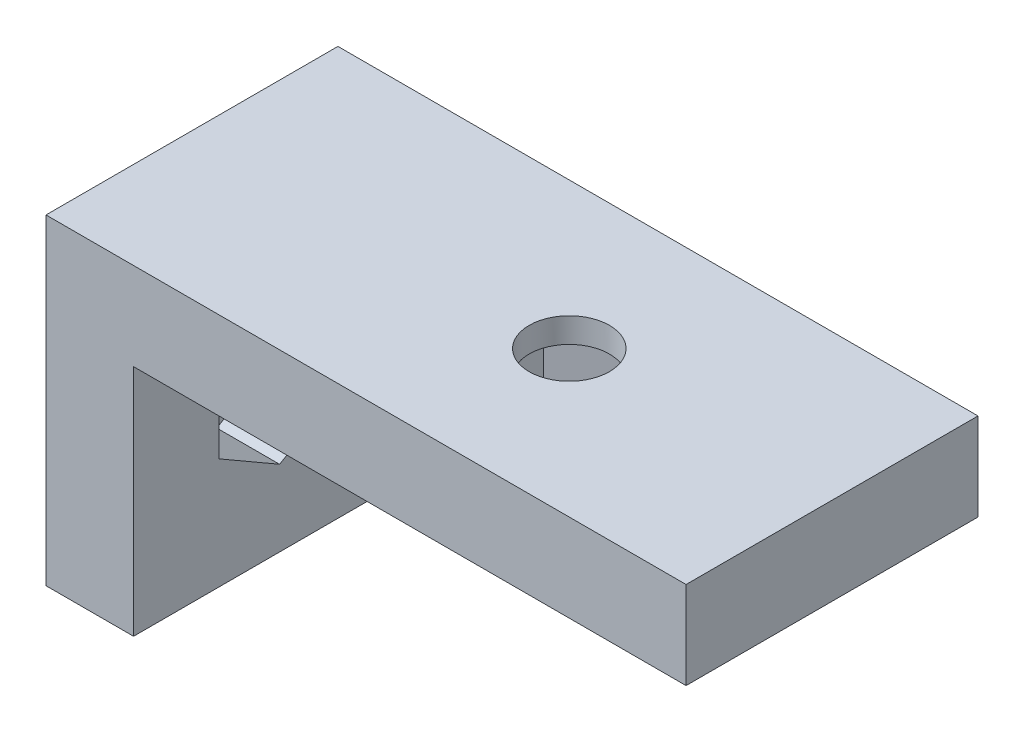
ISO-10303-21;
HEADER;
FILE_DESCRIPTION(('STEP AP214'),'2;1');
FILE_NAME('part.step','',(''),(''),'','','');
FILE_SCHEMA(('AUTOMOTIVE_DESIGN { 1 0 10303 214 1 1 1 1 }'));
ENDSEC;
DATA;
#1=APPLICATION_CONTEXT('core data for automotive mechanical design processes');
#2=APPLICATION_PROTOCOL_DEFINITION('international standard','automotive_design',2000,#1);
#3=PRODUCT_CONTEXT('',#1,'mechanical');
#4=PRODUCT('Part','Part','',(#3));
#5=PRODUCT_RELATED_PRODUCT_CATEGORY('part','',(#4));
#6=PRODUCT_DEFINITION_FORMATION('','',#4);
#7=PRODUCT_DEFINITION_CONTEXT('part definition',#1,'design');
#8=PRODUCT_DEFINITION('design','',#6,#7);
#9=PRODUCT_DEFINITION_SHAPE('','',#8);
#10=(LENGTH_UNIT() NAMED_UNIT(*) SI_UNIT(.MILLI.,.METRE.));
#11=(NAMED_UNIT(*) PLANE_ANGLE_UNIT() SI_UNIT($,.RADIAN.));
#12=(NAMED_UNIT(*) SI_UNIT($,.STERADIAN.) SOLID_ANGLE_UNIT());
#13=UNCERTAINTY_MEASURE_WITH_UNIT(LENGTH_MEASURE(1.E-05),#10,'distance_accuracy_value','');
#14=(GEOMETRIC_REPRESENTATION_CONTEXT(3) GLOBAL_UNCERTAINTY_ASSIGNED_CONTEXT((#13)) GLOBAL_UNIT_ASSIGNED_CONTEXT((#10,
#11,#12)) REPRESENTATION_CONTEXT('',''));
#15=CARTESIAN_POINT('',(0.,0.,0.));
#16=DIRECTION('',(0.,0.,1.));
#17=DIRECTION('',(1.,0.,0.));
#18=AXIS2_PLACEMENT_3D('',#15,#16,#17);
#19=CARTESIAN_POINT('',(6.15,-12.,10.));
#20=DIRECTION('',(-1.,0.,0.));
#21=DIRECTION('',(0.,0.,1.));
#22=AXIS2_PLACEMENT_3D('',#19,#20,#21);
#23=CYLINDRICAL_SURFACE('',#22,2.75);
#24=CARTESIAN_POINT('',(6.15,-12.,10.));
#25=DIRECTION('',(1.,0.,0.));
#26=DIRECTION('',(0.,0.,-1.));
#27=AXIS2_PLACEMENT_3D('',#24,#25,#26);
#28=CIRCLE('',#27,2.75);
#29=CARTESIAN_POINT('',(6.15,-12.,7.25));
#30=VERTEX_POINT('',#29);
#31=EDGE_CURVE('E222',#30,#30,#28,.F.);
#32=ORIENTED_EDGE('',*,*,#31,.T.);
#33=EDGE_LOOP('',(#32));
#34=FACE_BOUND('',#33,.T.);
#35=CARTESIAN_POINT('',(7.85,-12.,10.));
#36=DIRECTION('',(1.,0.,0.));
#37=DIRECTION('',(0.,0.,-1.));
#38=AXIS2_PLACEMENT_3D('',#35,#36,#37);
#39=CIRCLE('',#38,2.75);
#40=CARTESIAN_POINT('',(7.85,-12.,7.25));
#41=VERTEX_POINT('',#40);
#42=EDGE_CURVE('E45',#41,#41,#39,.T.);
#43=ORIENTED_EDGE('',*,*,#42,.T.);
#44=EDGE_LOOP('',(#43));
#45=FACE_BOUND('',#44,.T.);
#46=ADVANCED_FACE('F41',(#34,#45),#23,.F.);
#47=CARTESIAN_POINT('',(6.15,0.,20.));
#48=DIRECTION('',(1.,0.,0.));
#49=DIRECTION('',(0.,0.,-1.));
#50=AXIS2_PLACEMENT_3D('',#47,#48,#49);
#51=PLANE('',#50);
#52=ORIENTED_EDGE('',*,*,#31,.F.);
#53=EDGE_LOOP('',(#52));
#54=FACE_BOUND('',#53,.T.);
#55=DIRECTION('',(0.,-1.,0.));
#56=VECTOR('',#55,1.);
#57=CARTESIAN_POINT('',(6.15,0.,0.));
#58=LINE('',#57,#56);
#59=CARTESIAN_POINT('',(6.15,0.,0.));
#60=VERTEX_POINT('',#59);
#61=CARTESIAN_POINT('',(6.15,-22.,0.));
#62=VERTEX_POINT('',#61);
#63=EDGE_CURVE('E287',#60,#62,#58,.T.);
#64=ORIENTED_EDGE('',*,*,#63,.T.);
#65=DIRECTION('',(0.,0.,-1.));
#66=VECTOR('',#65,1.);
#67=CARTESIAN_POINT('',(6.15,-22.,20.));
#68=LINE('',#67,#66);
#69=CARTESIAN_POINT('',(6.15,-22.,20.));
#70=VERTEX_POINT('',#69);
#71=EDGE_CURVE('E11',#70,#62,#68,.T.);
#72=ORIENTED_EDGE('',*,*,#71,.F.);
#73=DIRECTION('',(0.,-1.,0.));
#74=VECTOR('',#73,1.);
#75=CARTESIAN_POINT('',(6.15,0.,20.));
#76=LINE('',#75,#74);
#77=CARTESIAN_POINT('',(6.15,0.,20.));
#78=VERTEX_POINT('',#77);
#79=EDGE_CURVE('E272',#78,#70,#76,.T.);
#80=ORIENTED_EDGE('',*,*,#79,.F.);
#81=DIRECTION('',(0.,0.,-1.));
#82=VECTOR('',#81,1.);
#83=CARTESIAN_POINT('',(6.15,0.,20.));
#84=LINE('',#83,#82);
#85=EDGE_CURVE('E286',#78,#60,#84,.T.);
#86=ORIENTED_EDGE('',*,*,#85,.T.);
#87=EDGE_LOOP('',(#64,#72,#80,#86));
#88=FACE_BOUND('',#87,.T.);
#89=ADVANCED_FACE('F43',(#54,#88),#51,.F.);
#90=CARTESIAN_POINT('',(6.15,-22.,20.));
#91=DIRECTION('',(0.,1.,0.));
#92=DIRECTION('',(0.,0.,1.));
#93=AXIS2_PLACEMENT_3D('',#90,#91,#92);
#94=PLANE('',#93);
#95=DIRECTION('',(1.,0.,0.));
#96=VECTOR('',#95,1.);
#97=CARTESIAN_POINT('',(6.15,-22.,0.));
#98=LINE('',#97,#96);
#99=CARTESIAN_POINT('',(12.15,-22.,0.));
#100=VERTEX_POINT('',#99);
#101=EDGE_CURVE('E290',#62,#100,#98,.T.);
#102=ORIENTED_EDGE('',*,*,#101,.T.);
#103=DIRECTION('',(0.,0.,-1.));
#104=VECTOR('',#103,1.);
#105=CARTESIAN_POINT('',(12.15,-22.,20.));
#106=LINE('',#105,#104);
#107=CARTESIAN_POINT('',(12.15,-22.,20.));
#108=VERTEX_POINT('',#107);
#109=EDGE_CURVE('E50',#108,#100,#106,.T.);
#110=ORIENTED_EDGE('',*,*,#109,.F.);
#111=DIRECTION('',(1.,0.,0.));
#112=VECTOR('',#111,1.);
#113=CARTESIAN_POINT('',(6.15,-22.,20.));
#114=LINE('',#113,#112);
#115=EDGE_CURVE('E275',#70,#108,#114,.T.);
#116=ORIENTED_EDGE('',*,*,#115,.F.);
#117=ORIENTED_EDGE('',*,*,#71,.T.);
#118=EDGE_LOOP('',(#102,#110,#116,#117));
#119=FACE_BOUND('',#118,.T.);
#120=ADVANCED_FACE('F341',(#119),#94,.F.);
#121=CARTESIAN_POINT('',(12.15,-22.,20.));
#122=DIRECTION('',(-1.,0.,0.));
#123=DIRECTION('',(0.,0.,1.));
#124=AXIS2_PLACEMENT_3D('',#121,#122,#123);
#125=PLANE('',#124);
#126=DIRECTION('',(0.,-0.5,0.866025403784439));
#127=VECTOR('',#126,1.);
#128=CARTESIAN_POINT('',(12.15,-7.20799276572611,10.));
#129=LINE('',#128,#127);
#130=CARTESIAN_POINT('',(12.15,-7.2079927657261,10.));
#131=VERTEX_POINT('',#130);
#132=CARTESIAN_POINT('',(12.15,-9.60399638286305,14.15));
#133=VERTEX_POINT('',#132);
#134=EDGE_CURVE('E203',#131,#133,#129,.T.);
#135=ORIENTED_EDGE('',*,*,#134,.F.);
#136=DIRECTION('',(0.,0.5,0.866025403784439));
#137=VECTOR('',#136,1.);
#138=CARTESIAN_POINT('',(12.15,-9.60399638286305,5.85));
#139=LINE('',#138,#137);
#140=CARTESIAN_POINT('',(12.15,-9.60399638286305,5.85));
#141=VERTEX_POINT('',#140);
#142=EDGE_CURVE('E58',#141,#131,#139,.T.);
#143=ORIENTED_EDGE('',*,*,#142,.F.);
#144=DIRECTION('',(0.,1.,0.));
#145=VECTOR('',#144,1.);
#146=CARTESIAN_POINT('',(12.15,-14.3960036171369,5.85));
#147=LINE('',#146,#145);
#148=CARTESIAN_POINT('',(12.15,-14.3960036171369,5.85));
#149=VERTEX_POINT('',#148);
#150=EDGE_CURVE('E189',#149,#141,#147,.T.);
#151=ORIENTED_EDGE('',*,*,#150,.F.);
#152=DIRECTION('',(0.,0.5,-0.866025403784439));
#153=VECTOR('',#152,1.);
#154=CARTESIAN_POINT('',(12.15,-16.7920072342739,10.));
#155=LINE('',#154,#153);
#156=CARTESIAN_POINT('',(12.15,-16.7920072342739,10.));
#157=VERTEX_POINT('',#156);
#158=EDGE_CURVE('E192',#157,#149,#155,.T.);
#159=ORIENTED_EDGE('',*,*,#158,.F.);
#160=DIRECTION('',(0.,-0.5,-0.866025403784438));
#161=VECTOR('',#160,1.);
#162=CARTESIAN_POINT('',(12.15,-14.3960036171369,14.15));
#163=LINE('',#162,#161);
#164=CARTESIAN_POINT('',(12.15,-14.3960036171369,14.15));
#165=VERTEX_POINT('',#164);
#166=EDGE_CURVE('E208',#165,#157,#163,.T.);
#167=ORIENTED_EDGE('',*,*,#166,.F.);
#168=DIRECTION('',(0.,-1.,0.));
#169=VECTOR('',#168,1.);
#170=CARTESIAN_POINT('',(12.15,-9.60399638286305,14.15));
#171=LINE('',#170,#169);
#172=EDGE_CURVE('E205',#133,#165,#171,.T.);
#173=ORIENTED_EDGE('',*,*,#172,.F.);
#174=EDGE_LOOP('',(#135,#143,#151,#159,#167,#173));
#175=FACE_BOUND('',#174,.T.);
#176=DIRECTION('',(0.,1.,0.));
#177=VECTOR('',#176,1.);
#178=CARTESIAN_POINT('',(12.15,-22.,0.));
#179=LINE('',#178,#177);
#180=CARTESIAN_POINT('',(12.15,-6.,0.));
#181=VERTEX_POINT('',#180);
#182=EDGE_CURVE('E293',#100,#181,#179,.T.);
#183=ORIENTED_EDGE('',*,*,#182,.T.);
#184=DIRECTION('',(0.,0.,-1.));
#185=VECTOR('',#184,1.);
#186=CARTESIAN_POINT('',(12.15,-6.,20.));
#187=LINE('',#186,#185);
#188=CARTESIAN_POINT('',(12.15,-6.,20.));
#189=VERTEX_POINT('',#188);
#190=EDGE_CURVE('E308',#189,#181,#187,.T.);
#191=ORIENTED_EDGE('',*,*,#190,.F.);
#192=DIRECTION('',(0.,1.,0.));
#193=VECTOR('',#192,1.);
#194=CARTESIAN_POINT('',(12.15,-22.,20.));
#195=LINE('',#194,#193);
#196=EDGE_CURVE('E278',#108,#189,#195,.T.);
#197=ORIENTED_EDGE('',*,*,#196,.F.);
#198=ORIENTED_EDGE('',*,*,#109,.T.);
#199=EDGE_LOOP('',(#183,#191,#197,#198));
#200=FACE_BOUND('',#199,.T.);
#201=ADVANCED_FACE('F406',(#175,#200),#125,.F.);
#202=CARTESIAN_POINT('',(12.15,-6.,20.));
#203=DIRECTION('',(0.,1.,0.));
#204=DIRECTION('',(0.,0.,1.));
#205=AXIS2_PLACEMENT_3D('',#202,#203,#204);
#206=PLANE('',#205);
#207=DIRECTION('',(0.,0.,-1.));
#208=VECTOR('',#207,1.);
#209=CARTESIAN_POINT('',(27.85,-6.,7.60399638286305));
#210=LINE('',#209,#208);
#211=CARTESIAN_POINT('',(27.85,-6.,12.3960036171369));
#212=VERTEX_POINT('',#211);
#213=CARTESIAN_POINT('',(27.85,-6.,7.60399638286305));
#214=VERTEX_POINT('',#213);
#215=EDGE_CURVE('E246',#212,#214,#210,.T.);
#216=ORIENTED_EDGE('',*,*,#215,.F.);
#217=DIRECTION('',(-0.866025403784439,0.,-0.5));
#218=VECTOR('',#217,1.);
#219=CARTESIAN_POINT('',(27.85,-6.,12.3960036171369));
#220=LINE('',#219,#218);
#221=CARTESIAN_POINT('',(32.,-6.,14.7920072342739));
#222=VERTEX_POINT('',#221);
#223=EDGE_CURVE('E66',#222,#212,#220,.T.);
#224=ORIENTED_EDGE('',*,*,#223,.F.);
#225=DIRECTION('',(-0.866025403784439,0.,0.5));
#226=VECTOR('',#225,1.);
#227=CARTESIAN_POINT('',(32.,-6.,14.7920072342739));
#228=LINE('',#227,#226);
#229=CARTESIAN_POINT('',(36.15,-6.,12.3960036171369));
#230=VERTEX_POINT('',#229);
#231=EDGE_CURVE('E229',#230,#222,#228,.T.);
#232=ORIENTED_EDGE('',*,*,#231,.F.);
#233=DIRECTION('',(0.,0.,1.));
#234=VECTOR('',#233,1.);
#235=CARTESIAN_POINT('',(36.15,-6.,12.3960036171369));
#236=LINE('',#235,#234);
#237=CARTESIAN_POINT('',(36.15,-6.,7.60399638286305));
#238=VERTEX_POINT('',#237);
#239=EDGE_CURVE('E255',#238,#230,#236,.T.);
#240=ORIENTED_EDGE('',*,*,#239,.F.);
#241=DIRECTION('',(0.866025403784439,0.,0.5));
#242=VECTOR('',#241,1.);
#243=CARTESIAN_POINT('',(36.15,-6.,7.60399638286305));
#244=LINE('',#243,#242);
#245=CARTESIAN_POINT('',(32.,-6.,5.20799276572611));
#246=VERTEX_POINT('',#245);
#247=EDGE_CURVE('E252',#246,#238,#244,.T.);
#248=ORIENTED_EDGE('',*,*,#247,.F.);
#249=DIRECTION('',(0.866025403784439,0.,-0.5));
#250=VECTOR('',#249,1.);
#251=CARTESIAN_POINT('',(32.,-6.,5.20799276572611));
#252=LINE('',#251,#250);
#253=EDGE_CURVE('E249',#214,#246,#252,.T.);
#254=ORIENTED_EDGE('',*,*,#253,.F.);
#255=EDGE_LOOP('',(#216,#224,#232,#240,#248,#254));
#256=FACE_BOUND('',#255,.T.);
#257=DIRECTION('',(1.,0.,0.));
#258=VECTOR('',#257,1.);
#259=CARTESIAN_POINT('',(12.15,-6.,0.));
#260=LINE('',#259,#258);
#261=CARTESIAN_POINT('',(50.,-6.,0.));
#262=VERTEX_POINT('',#261);
#263=EDGE_CURVE('E295',#181,#262,#260,.T.);
#264=ORIENTED_EDGE('',*,*,#263,.T.);
#265=DIRECTION('',(0.,0.,-1.));
#266=VECTOR('',#265,1.);
#267=CARTESIAN_POINT('',(50.,-6.,20.));
#268=LINE('',#267,#266);
#269=CARTESIAN_POINT('',(50.,-6.,20.));
#270=VERTEX_POINT('',#269);
#271=EDGE_CURVE('E305',#270,#262,#268,.T.);
#272=ORIENTED_EDGE('',*,*,#271,.F.);
#273=DIRECTION('',(1.,0.,0.));
#274=VECTOR('',#273,1.);
#275=CARTESIAN_POINT('',(12.15,-6.,20.));
#276=LINE('',#275,#274);
#277=EDGE_CURVE('E280',#189,#270,#276,.T.);
#278=ORIENTED_EDGE('',*,*,#277,.F.);
#279=ORIENTED_EDGE('',*,*,#190,.T.);
#280=EDGE_LOOP('',(#264,#272,#278,#279));
#281=FACE_BOUND('',#280,.T.);
#282=ADVANCED_FACE('F409',(#256,#281),#206,.F.);
#283=CARTESIAN_POINT('',(50.,-6.,20.));
#284=DIRECTION('',(-1.,0.,0.));
#285=DIRECTION('',(0.,0.,1.));
#286=AXIS2_PLACEMENT_3D('',#283,#284,#285);
#287=PLANE('',#286);
#288=DIRECTION('',(0.,1.,0.));
#289=VECTOR('',#288,1.);
#290=CARTESIAN_POINT('',(50.,-6.,0.));
#291=LINE('',#290,#289);
#292=CARTESIAN_POINT('',(50.,0.,0.));
#293=VERTEX_POINT('',#292);
#294=EDGE_CURVE('E297',#262,#293,#291,.T.);
#295=ORIENTED_EDGE('',*,*,#294,.T.);
#296=DIRECTION('',(0.,0.,-1.));
#297=VECTOR('',#296,1.);
#298=CARTESIAN_POINT('',(50.,0.,20.));
#299=LINE('',#298,#297);
#300=CARTESIAN_POINT('',(50.,0.,20.));
#301=VERTEX_POINT('',#300);
#302=EDGE_CURVE('E302',#301,#293,#299,.T.);
#303=ORIENTED_EDGE('',*,*,#302,.F.);
#304=DIRECTION('',(0.,1.,0.));
#305=VECTOR('',#304,1.);
#306=CARTESIAN_POINT('',(50.,-6.,20.));
#307=LINE('',#306,#305);
#308=EDGE_CURVE('E282',#270,#301,#307,.T.);
#309=ORIENTED_EDGE('',*,*,#308,.F.);
#310=ORIENTED_EDGE('',*,*,#271,.T.);
#311=EDGE_LOOP('',(#295,#303,#309,#310));
#312=FACE_BOUND('',#311,.T.);
#313=ADVANCED_FACE('F428',(#312),#287,.F.);
#314=CARTESIAN_POINT('',(50.,0.,20.));
#315=DIRECTION('',(0.,-1.,0.));
#316=DIRECTION('',(0.,0.,-1.));
#317=AXIS2_PLACEMENT_3D('',#314,#315,#316);
#318=PLANE('',#317);
#319=CARTESIAN_POINT('',(32.,0.,10.));
#320=DIRECTION('',(0.,-1.,0.));
#321=DIRECTION('',(0.,0.,-1.));
#322=AXIS2_PLACEMENT_3D('',#319,#320,#321);
#323=CIRCLE('',#322,2.75);
#324=CARTESIAN_POINT('',(32.,0.,7.25));
#325=VERTEX_POINT('',#324);
#326=EDGE_CURVE('E291',#325,#325,#323,.T.);
#327=ORIENTED_EDGE('',*,*,#326,.T.);
#328=EDGE_LOOP('',(#327));
#329=FACE_BOUND('',#328,.T.);
#330=DIRECTION('',(-1.,0.,0.));
#331=VECTOR('',#330,1.);
#332=CARTESIAN_POINT('',(50.,0.,0.));
#333=LINE('',#332,#331);
#334=EDGE_CURVE('E276',#293,#60,#333,.T.);
#335=ORIENTED_EDGE('',*,*,#334,.T.);
#336=ORIENTED_EDGE('',*,*,#85,.F.);
#337=DIRECTION('',(-1.,0.,0.));
#338=VECTOR('',#337,1.);
#339=CARTESIAN_POINT('',(50.,0.,20.));
#340=LINE('',#339,#338);
#341=EDGE_CURVE('E284',#301,#78,#340,.T.);
#342=ORIENTED_EDGE('',*,*,#341,.F.);
#343=ORIENTED_EDGE('',*,*,#302,.T.);
#344=EDGE_LOOP('',(#335,#336,#342,#343));
#345=FACE_BOUND('',#344,.T.);
#346=ADVANCED_FACE('F439',(#329,#345),#318,.F.);
#347=CARTESIAN_POINT('',(0.,0.,20.));
#348=DIRECTION('',(0.,0.,1.));
#349=DIRECTION('',(1.,0.,0.));
#350=AXIS2_PLACEMENT_3D('',#347,#348,#349);
#351=PLANE('',#350);
#352=ORIENTED_EDGE('',*,*,#79,.T.);
#353=ORIENTED_EDGE('',*,*,#115,.T.);
#354=ORIENTED_EDGE('',*,*,#196,.T.);
#355=ORIENTED_EDGE('',*,*,#277,.T.);
#356=ORIENTED_EDGE('',*,*,#308,.T.);
#357=ORIENTED_EDGE('',*,*,#341,.T.);
#358=EDGE_LOOP('',(#352,#353,#354,#355,#356,#357));
#359=FACE_BOUND('',#358,.T.);
#360=ADVANCED_FACE('F449',(#359),#351,.T.);
#361=CARTESIAN_POINT('',(0.,0.,0.));
#362=DIRECTION('',(0.,0.,1.));
#363=DIRECTION('',(1.,0.,0.));
#364=AXIS2_PLACEMENT_3D('',#361,#362,#363);
#365=PLANE('',#364);
#366=ORIENTED_EDGE('',*,*,#63,.F.);
#367=ORIENTED_EDGE('',*,*,#334,.F.);
#368=ORIENTED_EDGE('',*,*,#294,.F.);
#369=ORIENTED_EDGE('',*,*,#263,.F.);
#370=ORIENTED_EDGE('',*,*,#182,.F.);
#371=ORIENTED_EDGE('',*,*,#101,.F.);
#372=EDGE_LOOP('',(#366,#367,#368,#369,#370,#371));
#373=FACE_BOUND('',#372,.T.);
#374=ADVANCED_FACE('F331',(#373),#365,.F.);
#375=CARTESIAN_POINT('',(32.,-22.,10.));
#376=DIRECTION('',(0.,1.,0.));
#377=DIRECTION('',(0.,0.,1.));
#378=AXIS2_PLACEMENT_3D('',#375,#376,#377);
#379=CYLINDRICAL_SURFACE('',#378,2.75);
#380=CARTESIAN_POINT('',(32.,-1.7,10.));
#381=DIRECTION('',(0.,1.,0.));
#382=DIRECTION('',(0.,0.,1.));
#383=AXIS2_PLACEMENT_3D('',#380,#381,#382);
#384=CIRCLE('',#383,2.75);
#385=CARTESIAN_POINT('',(32.,-1.7,12.75));
#386=VERTEX_POINT('',#385);
#387=EDGE_CURVE('E262',#386,#386,#384,.F.);
#388=ORIENTED_EDGE('',*,*,#387,.T.);
#389=EDGE_LOOP('',(#388));
#390=FACE_BOUND('',#389,.T.);
#391=ORIENTED_EDGE('',*,*,#326,.F.);
#392=EDGE_LOOP('',(#391));
#393=FACE_BOUND('',#392,.T.);
#394=ADVANCED_FACE('F317',(#390,#393),#379,.F.);
#395=CARTESIAN_POINT('',(0.,-1.7,0.));
#396=DIRECTION('',(0.,1.,0.));
#397=DIRECTION('',(0.,0.,1.));
#398=AXIS2_PLACEMENT_3D('',#395,#396,#397);
#399=PLANE('',#398);
#400=DIRECTION('',(-0.866025403784439,0.,-0.5));
#401=VECTOR('',#400,1.);
#402=CARTESIAN_POINT('',(27.85,-1.7,12.3960036171369));
#403=LINE('',#402,#401);
#404=CARTESIAN_POINT('',(32.,-1.7,14.7920072342739));
#405=VERTEX_POINT('',#404);
#406=CARTESIAN_POINT('',(27.85,-1.7,12.3960036171369));
#407=VERTEX_POINT('',#406);
#408=EDGE_CURVE('E225',#405,#407,#403,.T.);
#409=ORIENTED_EDGE('',*,*,#408,.T.);
#410=DIRECTION('',(0.,0.,-1.));
#411=VECTOR('',#410,1.);
#412=CARTESIAN_POINT('',(27.85,-1.7,7.60399638286305));
#413=LINE('',#412,#411);
#414=CARTESIAN_POINT('',(27.85,-1.7,7.60399638286305));
#415=VERTEX_POINT('',#414);
#416=EDGE_CURVE('E228',#407,#415,#413,.T.);
#417=ORIENTED_EDGE('',*,*,#416,.T.);
#418=DIRECTION('',(0.866025403784439,0.,-0.5));
#419=VECTOR('',#418,1.);
#420=CARTESIAN_POINT('',(32.,-1.7,5.20799276572611));
#421=LINE('',#420,#419);
#422=CARTESIAN_POINT('',(32.,-1.7,5.20799276572611));
#423=VERTEX_POINT('',#422);
#424=EDGE_CURVE('E232',#415,#423,#421,.T.);
#425=ORIENTED_EDGE('',*,*,#424,.T.);
#426=DIRECTION('',(0.866025403784439,0.,0.5));
#427=VECTOR('',#426,1.);
#428=CARTESIAN_POINT('',(36.15,-1.7,7.60399638286305));
#429=LINE('',#428,#427);
#430=CARTESIAN_POINT('',(36.15,-1.7,7.60399638286305));
#431=VERTEX_POINT('',#430);
#432=EDGE_CURVE('E235',#423,#431,#429,.T.);
#433=ORIENTED_EDGE('',*,*,#432,.T.);
#434=DIRECTION('',(0.,0.,1.));
#435=VECTOR('',#434,1.);
#436=CARTESIAN_POINT('',(36.15,-1.7,12.3960036171369));
#437=LINE('',#436,#435);
#438=CARTESIAN_POINT('',(36.15,-1.7,12.3960036171369));
#439=VERTEX_POINT('',#438);
#440=EDGE_CURVE('E238',#431,#439,#437,.T.);
#441=ORIENTED_EDGE('',*,*,#440,.T.);
#442=DIRECTION('',(-0.866025403784439,0.,0.5));
#443=VECTOR('',#442,1.);
#444=CARTESIAN_POINT('',(32.,-1.7,14.7920072342739));
#445=LINE('',#444,#443);
#446=EDGE_CURVE('E241',#439,#405,#445,.T.);
#447=ORIENTED_EDGE('',*,*,#446,.T.);
#448=EDGE_LOOP('',(#409,#417,#425,#433,#441,#447));
#449=FACE_BOUND('',#448,.T.);
#450=ORIENTED_EDGE('',*,*,#387,.F.);
#451=EDGE_LOOP('',(#450));
#452=FACE_BOUND('',#451,.T.);
#453=ADVANCED_FACE('F320',(#449,#452),#399,.F.);
#454=CARTESIAN_POINT('',(27.85,-1.7,12.3960036171369));
#455=DIRECTION('',(-0.5,0.,0.866025403784439));
#456=DIRECTION('',(0.866025403784439,0.,0.5));
#457=AXIS2_PLACEMENT_3D('',#454,#455,#456);
#458=PLANE('',#457);
#459=ORIENTED_EDGE('',*,*,#223,.T.);
#460=DIRECTION('',(0.,-1.,0.));
#461=VECTOR('',#460,1.);
#462=CARTESIAN_POINT('',(27.85,-1.7,12.3960036171369));
#463=LINE('',#462,#461);
#464=EDGE_CURVE('E244',#407,#212,#463,.T.);
#465=ORIENTED_EDGE('',*,*,#464,.F.);
#466=ORIENTED_EDGE('',*,*,#408,.F.);
#467=DIRECTION('',(0.,-1.,0.));
#468=VECTOR('',#467,1.);
#469=CARTESIAN_POINT('',(32.,-1.7,14.7920072342739));
#470=LINE('',#469,#468);
#471=EDGE_CURVE('E260',#405,#222,#470,.T.);
#472=ORIENTED_EDGE('',*,*,#471,.T.);
#473=EDGE_LOOP('',(#459,#465,#466,#472));
#474=FACE_BOUND('',#473,.T.);
#475=ADVANCED_FACE('F322',(#474),#458,.F.);
#476=CARTESIAN_POINT('',(32.,-1.7,14.7920072342739));
#477=DIRECTION('',(0.5,0.,0.866025403784439));
#478=DIRECTION('',(0.866025403784439,0.,-0.5));
#479=AXIS2_PLACEMENT_3D('',#476,#477,#478);
#480=PLANE('',#479);
#481=ORIENTED_EDGE('',*,*,#231,.T.);
#482=ORIENTED_EDGE('',*,*,#471,.F.);
#483=ORIENTED_EDGE('',*,*,#446,.F.);
#484=DIRECTION('',(0.,-1.,0.));
#485=VECTOR('',#484,1.);
#486=CARTESIAN_POINT('',(36.15,-1.7,12.3960036171369));
#487=LINE('',#486,#485);
#488=EDGE_CURVE('E263',#439,#230,#487,.T.);
#489=ORIENTED_EDGE('',*,*,#488,.T.);
#490=EDGE_LOOP('',(#481,#482,#483,#489));
#491=FACE_BOUND('',#490,.T.);
#492=ADVANCED_FACE('F329',(#491),#480,.F.);
#493=CARTESIAN_POINT('',(36.15,-1.7,12.3960036171369));
#494=DIRECTION('',(1.,0.,0.));
#495=DIRECTION('',(0.,0.,-1.));
#496=AXIS2_PLACEMENT_3D('',#493,#494,#495);
#497=PLANE('',#496);
#498=ORIENTED_EDGE('',*,*,#239,.T.);
#499=ORIENTED_EDGE('',*,*,#488,.F.);
#500=ORIENTED_EDGE('',*,*,#440,.F.);
#501=DIRECTION('',(0.,-1.,0.));
#502=VECTOR('',#501,1.);
#503=CARTESIAN_POINT('',(36.15,-1.7,7.60399638286305));
#504=LINE('',#503,#502);
#505=EDGE_CURVE('E265',#431,#238,#504,.T.);
#506=ORIENTED_EDGE('',*,*,#505,.T.);
#507=EDGE_LOOP('',(#498,#499,#500,#506));
#508=FACE_BOUND('',#507,.T.);
#509=ADVANCED_FACE('F492',(#508),#497,.F.);
#510=CARTESIAN_POINT('',(36.15,-1.7,7.60399638286305));
#511=DIRECTION('',(0.5,0.,-0.866025403784439));
#512=DIRECTION('',(-0.866025403784439,0.,-0.5));
#513=AXIS2_PLACEMENT_3D('',#510,#511,#512);
#514=PLANE('',#513);
#515=ORIENTED_EDGE('',*,*,#247,.T.);
#516=ORIENTED_EDGE('',*,*,#505,.F.);
#517=ORIENTED_EDGE('',*,*,#432,.F.);
#518=DIRECTION('',(0.,-1.,0.));
#519=VECTOR('',#518,1.);
#520=CARTESIAN_POINT('',(32.,-1.7,5.20799276572611));
#521=LINE('',#520,#519);
#522=EDGE_CURVE('E267',#423,#246,#521,.T.);
#523=ORIENTED_EDGE('',*,*,#522,.T.);
#524=EDGE_LOOP('',(#515,#516,#517,#523));
#525=FACE_BOUND('',#524,.T.);
#526=ADVANCED_FACE('F501',(#525),#514,.F.);
#527=CARTESIAN_POINT('',(32.,-1.7,5.20799276572611));
#528=DIRECTION('',(-0.5,0.,-0.866025403784439));
#529=DIRECTION('',(-0.866025403784439,0.,0.5));
#530=AXIS2_PLACEMENT_3D('',#527,#528,#529);
#531=PLANE('',#530);
#532=ORIENTED_EDGE('',*,*,#253,.T.);
#533=ORIENTED_EDGE('',*,*,#522,.F.);
#534=ORIENTED_EDGE('',*,*,#424,.F.);
#535=DIRECTION('',(0.,-1.,0.));
#536=VECTOR('',#535,1.);
#537=CARTESIAN_POINT('',(27.85,-1.7,7.60399638286305));
#538=LINE('',#537,#536);
#539=EDGE_CURVE('E269',#415,#214,#538,.T.);
#540=ORIENTED_EDGE('',*,*,#539,.T.);
#541=EDGE_LOOP('',(#532,#533,#534,#540));
#542=FACE_BOUND('',#541,.T.);
#543=ADVANCED_FACE('F511',(#542),#531,.F.);
#544=CARTESIAN_POINT('',(27.85,-1.7,7.60399638286305));
#545=DIRECTION('',(-1.,0.,0.));
#546=DIRECTION('',(0.,0.,1.));
#547=AXIS2_PLACEMENT_3D('',#544,#545,#546);
#548=PLANE('',#547);
#549=ORIENTED_EDGE('',*,*,#215,.T.);
#550=ORIENTED_EDGE('',*,*,#539,.F.);
#551=ORIENTED_EDGE('',*,*,#416,.F.);
#552=ORIENTED_EDGE('',*,*,#464,.T.);
#553=EDGE_LOOP('',(#549,#550,#551,#552));
#554=FACE_BOUND('',#553,.T.);
#555=ADVANCED_FACE('F348',(#554),#548,.F.);
#556=CARTESIAN_POINT('',(7.85,-9.60399638286305,5.85));
#557=DIRECTION('',(0.,0.866025403784439,-0.5));
#558=DIRECTION('',(0.,0.5,0.866025403784439));
#559=AXIS2_PLACEMENT_3D('',#556,#557,#558);
#560=PLANE('',#559);
#561=ORIENTED_EDGE('',*,*,#142,.T.);
#562=DIRECTION('',(1.,0.,0.));
#563=VECTOR('',#562,1.);
#564=CARTESIAN_POINT('',(7.85,-7.20799276572611,10.));
#565=LINE('',#564,#563);
#566=CARTESIAN_POINT('',(7.85,-7.20799276572611,10.));
#567=VERTEX_POINT('',#566);
#568=EDGE_CURVE('E166',#567,#131,#565,.T.);
#569=ORIENTED_EDGE('',*,*,#568,.F.);
#570=DIRECTION('',(0.,0.5,0.866025403784439));
#571=VECTOR('',#570,1.);
#572=CARTESIAN_POINT('',(7.85,-9.60399638286305,5.85));
#573=LINE('',#572,#571);
#574=CARTESIAN_POINT('',(7.85,-9.60399638286305,5.85));
#575=VERTEX_POINT('',#574);
#576=EDGE_CURVE('E170',#575,#567,#573,.T.);
#577=ORIENTED_EDGE('',*,*,#576,.F.);
#578=DIRECTION('',(1.,0.,0.));
#579=VECTOR('',#578,1.);
#580=CARTESIAN_POINT('',(7.85,-9.60399638286305,5.85));
#581=LINE('',#580,#579);
#582=EDGE_CURVE('E213',#575,#141,#581,.T.);
#583=ORIENTED_EDGE('',*,*,#582,.T.);
#584=EDGE_LOOP('',(#561,#569,#577,#583));
#585=FACE_BOUND('',#584,.T.);
#586=ADVANCED_FACE('F168',(#585),#560,.F.);
#587=CARTESIAN_POINT('',(7.85,-14.3960036171369,5.85));
#588=DIRECTION('',(0.,0.,-1.));
#589=DIRECTION('',(0.,1.,0.));
#590=AXIS2_PLACEMENT_3D('',#587,#588,#589);
#591=PLANE('',#590);
#592=ORIENTED_EDGE('',*,*,#150,.T.);
#593=ORIENTED_EDGE('',*,*,#582,.F.);
#594=DIRECTION('',(0.,1.,0.));
#595=VECTOR('',#594,1.);
#596=CARTESIAN_POINT('',(7.85,-14.3960036171369,5.85));
#597=LINE('',#596,#595);
#598=CARTESIAN_POINT('',(7.85,-14.3960036171369,5.85));
#599=VERTEX_POINT('',#598);
#600=EDGE_CURVE('E176',#599,#575,#597,.T.);
#601=ORIENTED_EDGE('',*,*,#600,.F.);
#602=DIRECTION('',(1.,0.,0.));
#603=VECTOR('',#602,1.);
#604=CARTESIAN_POINT('',(7.85,-14.3960036171369,5.85));
#605=LINE('',#604,#603);
#606=EDGE_CURVE('E215',#599,#149,#605,.T.);
#607=ORIENTED_EDGE('',*,*,#606,.T.);
#608=EDGE_LOOP('',(#592,#593,#601,#607));
#609=FACE_BOUND('',#608,.T.);
#610=ADVANCED_FACE('F347',(#609),#591,.F.);
#611=CARTESIAN_POINT('',(7.85,-16.7920072342739,10.));
#612=DIRECTION('',(0.,-0.866025403784439,-0.5));
#613=DIRECTION('',(0.,0.5,-0.866025403784439));
#614=AXIS2_PLACEMENT_3D('',#611,#612,#613);
#615=PLANE('',#614);
#616=ORIENTED_EDGE('',*,*,#158,.T.);
#617=ORIENTED_EDGE('',*,*,#606,.F.);
#618=DIRECTION('',(0.,0.5,-0.866025403784439));
#619=VECTOR('',#618,1.);
#620=CARTESIAN_POINT('',(7.85,-16.7920072342739,10.));
#621=LINE('',#620,#619);
#622=CARTESIAN_POINT('',(7.85,-16.7920072342739,10.));
#623=VERTEX_POINT('',#622);
#624=EDGE_CURVE('E199',#623,#599,#621,.T.);
#625=ORIENTED_EDGE('',*,*,#624,.F.);
#626=DIRECTION('',(1.,0.,0.));
#627=VECTOR('',#626,1.);
#628=CARTESIAN_POINT('',(7.85,-16.7920072342739,10.));
#629=LINE('',#628,#627);
#630=EDGE_CURVE('E217',#623,#157,#629,.T.);
#631=ORIENTED_EDGE('',*,*,#630,.T.);
#632=EDGE_LOOP('',(#616,#617,#625,#631));
#633=FACE_BOUND('',#632,.T.);
#634=ADVANCED_FACE('F358',(#633),#615,.F.);
#635=CARTESIAN_POINT('',(7.85,-14.3960036171369,14.15));
#636=DIRECTION('',(0.,-0.866025403784438,0.5));
#637=DIRECTION('',(0.,-0.5,-0.866025403784438));
#638=AXIS2_PLACEMENT_3D('',#635,#636,#637);
#639=PLANE('',#638);
#640=ORIENTED_EDGE('',*,*,#166,.T.);
#641=ORIENTED_EDGE('',*,*,#630,.F.);
#642=DIRECTION('',(0.,-0.5,-0.866025403784438));
#643=VECTOR('',#642,1.);
#644=CARTESIAN_POINT('',(7.85,-14.3960036171369,14.15));
#645=LINE('',#644,#643);
#646=CARTESIAN_POINT('',(7.85,-14.3960036171369,14.15));
#647=VERTEX_POINT('',#646);
#648=EDGE_CURVE('E196',#647,#623,#645,.T.);
#649=ORIENTED_EDGE('',*,*,#648,.F.);
#650=DIRECTION('',(1.,0.,0.));
#651=VECTOR('',#650,1.);
#652=CARTESIAN_POINT('',(7.85,-14.3960036171369,14.15));
#653=LINE('',#652,#651);
#654=EDGE_CURVE('E219',#647,#165,#653,.T.);
#655=ORIENTED_EDGE('',*,*,#654,.T.);
#656=EDGE_LOOP('',(#640,#641,#649,#655));
#657=FACE_BOUND('',#656,.T.);
#658=ADVANCED_FACE('F354',(#657),#639,.F.);
#659=CARTESIAN_POINT('',(7.85,-9.60399638286305,14.15));
#660=DIRECTION('',(0.,0.,1.));
#661=DIRECTION('',(0.,-1.,0.));
#662=AXIS2_PLACEMENT_3D('',#659,#660,#661);
#663=PLANE('',#662);
#664=ORIENTED_EDGE('',*,*,#172,.T.);
#665=ORIENTED_EDGE('',*,*,#654,.F.);
#666=DIRECTION('',(0.,-1.,0.));
#667=VECTOR('',#666,1.);
#668=CARTESIAN_POINT('',(7.85,-9.60399638286305,14.15));
#669=LINE('',#668,#667);
#670=CARTESIAN_POINT('',(7.85,-9.60399638286305,14.15));
#671=VERTEX_POINT('',#670);
#672=EDGE_CURVE('E184',#671,#647,#669,.T.);
#673=ORIENTED_EDGE('',*,*,#672,.F.);
#674=DIRECTION('',(1.,0.,0.));
#675=VECTOR('',#674,1.);
#676=CARTESIAN_POINT('',(7.85,-9.60399638286305,14.15));
#677=LINE('',#676,#675);
#678=EDGE_CURVE('E175',#671,#133,#677,.T.);
#679=ORIENTED_EDGE('',*,*,#678,.T.);
#680=EDGE_LOOP('',(#664,#665,#673,#679));
#681=FACE_BOUND('',#680,.T.);
#682=ADVANCED_FACE('F351',(#681),#663,.F.);
#683=CARTESIAN_POINT('',(7.85,-7.20799276572611,10.));
#684=DIRECTION('',(0.,0.866025403784439,0.5));
#685=DIRECTION('',(0.,-0.5,0.866025403784439));
#686=AXIS2_PLACEMENT_3D('',#683,#684,#685);
#687=PLANE('',#686);
#688=ORIENTED_EDGE('',*,*,#134,.T.);
#689=ORIENTED_EDGE('',*,*,#678,.F.);
#690=DIRECTION('',(0.,-0.5,0.866025403784439));
#691=VECTOR('',#690,1.);
#692=CARTESIAN_POINT('',(7.85,-7.20799276572611,10.));
#693=LINE('',#692,#691);
#694=EDGE_CURVE('E179',#567,#671,#693,.T.);
#695=ORIENTED_EDGE('',*,*,#694,.F.);
#696=ORIENTED_EDGE('',*,*,#568,.T.);
#697=EDGE_LOOP('',(#688,#689,#695,#696));
#698=FACE_BOUND('',#697,.T.);
#699=ADVANCED_FACE('F180',(#698),#687,.F.);
#700=CARTESIAN_POINT('',(7.85,0.,0.));
#701=DIRECTION('',(1.,0.,0.));
#702=DIRECTION('',(0.,0.,-1.));
#703=AXIS2_PLACEMENT_3D('',#700,#701,#702);
#704=PLANE('',#703);
#705=ORIENTED_EDGE('',*,*,#42,.F.);
#706=EDGE_LOOP('',(#705));
#707=FACE_BOUND('',#706,.T.);
#708=ORIENTED_EDGE('',*,*,#576,.T.);
#709=ORIENTED_EDGE('',*,*,#694,.T.);
#710=ORIENTED_EDGE('',*,*,#672,.T.);
#711=ORIENTED_EDGE('',*,*,#648,.T.);
#712=ORIENTED_EDGE('',*,*,#624,.T.);
#713=ORIENTED_EDGE('',*,*,#600,.T.);
#714=EDGE_LOOP('',(#708,#709,#710,#711,#712,#713));
#715=FACE_BOUND('',#714,.T.);
#716=ADVANCED_FACE('F186',(#707,#715),#704,.T.);
#717=CLOSED_SHELL('',(#46,#89,#120,#201,#282,#313,#346,#360,#374,#394,#453,#475,#492,#509,#526,
#543,#555,#586,#610,#634,#658,#682,#699,#716));
#718=MANIFOLD_SOLID_BREP('B2',#717);
#719=ADVANCED_BREP_SHAPE_REPRESENTATION('',(#18,#718),#14);
#720=SHAPE_DEFINITION_REPRESENTATION(#9,#719);
ENDSEC;
END-ISO-10303-21;
